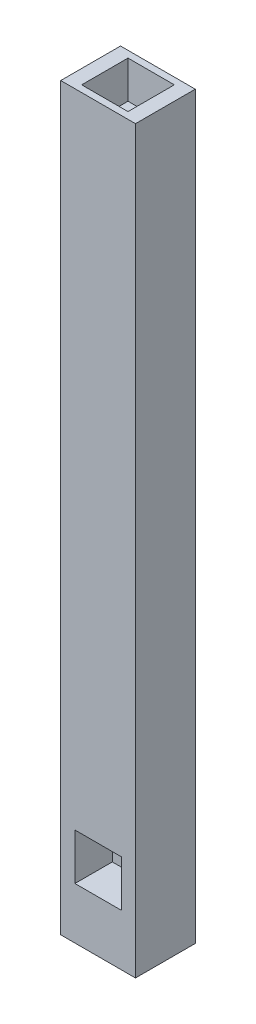
ISO-10303-21;
HEADER;
FILE_DESCRIPTION(('STEP AP214'),'2;1');
FILE_NAME('part.step','',(''),(''),'','','');
FILE_SCHEMA(('AUTOMOTIVE_DESIGN { 1 0 10303 214 1 1 1 1 }'));
ENDSEC;
DATA;
#1=APPLICATION_CONTEXT('core data for automotive mechanical design processes');
#2=APPLICATION_PROTOCOL_DEFINITION('international standard','automotive_design',2000,#1);
#3=PRODUCT_CONTEXT('',#1,'mechanical');
#4=PRODUCT('Part','Part','',(#3));
#5=PRODUCT_RELATED_PRODUCT_CATEGORY('part','',(#4));
#6=PRODUCT_DEFINITION_FORMATION('','',#4);
#7=PRODUCT_DEFINITION_CONTEXT('part definition',#1,'design');
#8=PRODUCT_DEFINITION('design','',#6,#7);
#9=PRODUCT_DEFINITION_SHAPE('','',#8);
#10=(LENGTH_UNIT() NAMED_UNIT(*) SI_UNIT(.MILLI.,.METRE.));
#11=(NAMED_UNIT(*) PLANE_ANGLE_UNIT() SI_UNIT($,.RADIAN.));
#12=(NAMED_UNIT(*) SI_UNIT($,.STERADIAN.) SOLID_ANGLE_UNIT());
#13=UNCERTAINTY_MEASURE_WITH_UNIT(LENGTH_MEASURE(1.E-05),#10,'distance_accuracy_value','');
#14=(GEOMETRIC_REPRESENTATION_CONTEXT(3) GLOBAL_UNCERTAINTY_ASSIGNED_CONTEXT((#13)) GLOBAL_UNIT_ASSIGNED_CONTEXT((#10,
#11,#12)) REPRESENTATION_CONTEXT('',''));
#15=CARTESIAN_POINT('',(0.,0.,0.));
#16=DIRECTION('',(0.,0.,1.));
#17=DIRECTION('',(1.,0.,0.));
#18=AXIS2_PLACEMENT_3D('',#15,#16,#17);
#19=CARTESIAN_POINT('',(-6.35,12.7,10.16));
#20=DIRECTION('',(0.,1.,0.));
#21=DIRECTION('',(0.,0.,1.));
#22=AXIS2_PLACEMENT_3D('',#19,#20,#21);
#23=PLANE('',#22);
#24=DIRECTION('',(-1.,0.,0.));
#25=VECTOR('',#24,1.);
#26=CARTESIAN_POINT('',(-3.937,12.7,9.017));
#27=LINE('',#26,#25);
#28=CARTESIAN_POINT('',(3.937,12.7,9.017));
#29=VERTEX_POINT('',#28);
#30=CARTESIAN_POINT('',(-3.937,12.7,9.017));
#31=VERTEX_POINT('',#30);
#32=EDGE_CURVE('E194',#29,#31,#27,.T.);
#33=ORIENTED_EDGE('',*,*,#32,.F.);
#34=DIRECTION('',(0.,0.,1.));
#35=VECTOR('',#34,1.);
#36=CARTESIAN_POINT('',(3.937,12.7,9.017));
#37=LINE('',#36,#35);
#38=CARTESIAN_POINT('',(3.937,12.7,1.143));
#39=VERTEX_POINT('',#38);
#40=EDGE_CURVE('E60',#39,#29,#37,.T.);
#41=ORIENTED_EDGE('',*,*,#40,.F.);
#42=DIRECTION('',(1.,0.,0.));
#43=VECTOR('',#42,1.);
#44=CARTESIAN_POINT('',(-3.937,12.7,1.143));
#45=LINE('',#44,#43);
#46=CARTESIAN_POINT('',(-3.937,12.7,1.143));
#47=VERTEX_POINT('',#46);
#48=EDGE_CURVE('E181',#47,#39,#45,.T.);
#49=ORIENTED_EDGE('',*,*,#48,.F.);
#50=DIRECTION('',(0.,0.,-1.));
#51=VECTOR('',#50,1.);
#52=CARTESIAN_POINT('',(-3.937,12.7,9.017));
#53=LINE('',#52,#51);
#54=EDGE_CURVE('E185',#31,#47,#53,.T.);
#55=ORIENTED_EDGE('',*,*,#54,.F.);
#56=EDGE_LOOP('',(#33,#41,#49,#55));
#57=FACE_BOUND('',#56,.T.);
#58=DIRECTION('',(1.,0.,0.));
#59=VECTOR('',#58,1.);
#60=CARTESIAN_POINT('',(-6.35,12.7,0.));
#61=LINE('',#60,#59);
#62=CARTESIAN_POINT('',(-6.35,12.7,0.));
#63=VERTEX_POINT('',#62);
#64=CARTESIAN_POINT('',(6.35,12.7,0.));
#65=VERTEX_POINT('',#64);
#66=EDGE_CURVE('E285',#63,#65,#61,.T.);
#67=ORIENTED_EDGE('',*,*,#66,.T.);
#68=DIRECTION('',(0.,0.,-1.));
#69=VECTOR('',#68,1.);
#70=CARTESIAN_POINT('',(6.35,12.7,10.16));
#71=LINE('',#70,#69);
#72=CARTESIAN_POINT('',(6.35,12.7,10.16));
#73=VERTEX_POINT('',#72);
#74=EDGE_CURVE('E11',#73,#65,#71,.T.);
#75=ORIENTED_EDGE('',*,*,#74,.F.);
#76=DIRECTION('',(1.,0.,0.));
#77=VECTOR('',#76,1.);
#78=CARTESIAN_POINT('',(-6.35,12.7,10.16));
#79=LINE('',#78,#77);
#80=CARTESIAN_POINT('',(-6.35,12.7,10.16));
#81=VERTEX_POINT('',#80);
#82=EDGE_CURVE('E295',#81,#73,#79,.T.);
#83=ORIENTED_EDGE('',*,*,#82,.F.);
#84=DIRECTION('',(0.,0.,-1.));
#85=VECTOR('',#84,1.);
#86=CARTESIAN_POINT('',(-6.35,12.7,10.16));
#87=LINE('',#86,#85);
#88=EDGE_CURVE('E311',#81,#63,#87,.T.);
#89=ORIENTED_EDGE('',*,*,#88,.T.);
#90=EDGE_LOOP('',(#67,#75,#83,#89));
#91=FACE_BOUND('',#90,.T.);
#92=ADVANCED_FACE('F45',(#57,#91),#23,.F.);
#93=CARTESIAN_POINT('',(6.35,12.7,10.16));
#94=DIRECTION('',(-1.,0.,0.));
#95=DIRECTION('',(0.,0.,1.));
#96=AXIS2_PLACEMENT_3D('',#93,#94,#95);
#97=PLANE('',#96);
#98=DIRECTION('',(0.,1.,0.));
#99=VECTOR('',#98,1.);
#100=CARTESIAN_POINT('',(6.35,12.7,0.));
#101=LINE('',#100,#99);
#102=CARTESIAN_POINT('',(6.35,138.43,0.));
#103=VERTEX_POINT('',#102);
#104=EDGE_CURVE('E315',#65,#103,#101,.T.);
#105=ORIENTED_EDGE('',*,*,#104,.T.);
#106=DIRECTION('',(0.,0.,-1.));
#107=VECTOR('',#106,1.);
#108=CARTESIAN_POINT('',(6.35,138.43,10.16));
#109=LINE('',#108,#107);
#110=CARTESIAN_POINT('',(6.35,138.43,10.16));
#111=VERTEX_POINT('',#110);
#112=EDGE_CURVE('E53',#111,#103,#109,.T.);
#113=ORIENTED_EDGE('',*,*,#112,.F.);
#114=DIRECTION('',(0.,1.,0.));
#115=VECTOR('',#114,1.);
#116=CARTESIAN_POINT('',(6.35,12.7,10.16));
#117=LINE('',#116,#115);
#118=EDGE_CURVE('E299',#73,#111,#117,.T.);
#119=ORIENTED_EDGE('',*,*,#118,.F.);
#120=ORIENTED_EDGE('',*,*,#74,.T.);
#121=EDGE_LOOP('',(#105,#113,#119,#120));
#122=FACE_BOUND('',#121,.T.);
#123=ADVANCED_FACE('F337',(#122),#97,.F.);
#124=CARTESIAN_POINT('',(-6.35,138.43,10.16));
#125=DIRECTION('',(0.,1.,0.));
#126=DIRECTION('',(0.,0.,1.));
#127=AXIS2_PLACEMENT_3D('',#124,#125,#126);
#128=PLANE('',#127);
#129=DIRECTION('',(0.,0.,1.));
#130=VECTOR('',#129,1.);
#131=CARTESIAN_POINT('',(-3.937,138.43,9.017));
#132=LINE('',#131,#130);
#133=CARTESIAN_POINT('',(-3.937,138.43,1.143));
#134=VERTEX_POINT('',#133);
#135=CARTESIAN_POINT('',(-3.937,138.43,9.017));
#136=VERTEX_POINT('',#135);
#137=EDGE_CURVE('E242',#134,#136,#132,.T.);
#138=ORIENTED_EDGE('',*,*,#137,.F.);
#139=DIRECTION('',(-1.,0.,0.));
#140=VECTOR('',#139,1.);
#141=CARTESIAN_POINT('',(3.937,138.43,1.143));
#142=LINE('',#141,#140);
#143=CARTESIAN_POINT('',(3.937,138.43,1.143));
#144=VERTEX_POINT('',#143);
#145=EDGE_CURVE('E256',#144,#134,#142,.T.);
#146=ORIENTED_EDGE('',*,*,#145,.F.);
#147=DIRECTION('',(0.,0.,-1.));
#148=VECTOR('',#147,1.);
#149=CARTESIAN_POINT('',(3.937,138.43,9.017));
#150=LINE('',#149,#148);
#151=CARTESIAN_POINT('',(3.937,138.43,9.017));
#152=VERTEX_POINT('',#151);
#153=EDGE_CURVE('E275',#152,#144,#150,.T.);
#154=ORIENTED_EDGE('',*,*,#153,.F.);
#155=DIRECTION('',(1.,0.,0.));
#156=VECTOR('',#155,1.);
#157=CARTESIAN_POINT('',(3.937,138.43,9.017));
#158=LINE('',#157,#156);
#159=EDGE_CURVE('E271',#136,#152,#158,.T.);
#160=ORIENTED_EDGE('',*,*,#159,.F.);
#161=EDGE_LOOP('',(#138,#146,#154,#160));
#162=FACE_BOUND('',#161,.T.);
#163=DIRECTION('',(1.,0.,0.));
#164=VECTOR('',#163,1.);
#165=CARTESIAN_POINT('',(-6.35,138.43,0.));
#166=LINE('',#165,#164);
#167=CARTESIAN_POINT('',(-6.35,138.43,0.));
#168=VERTEX_POINT('',#167);
#169=EDGE_CURVE('E319',#168,#103,#166,.T.);
#170=ORIENTED_EDGE('',*,*,#169,.F.);
#171=DIRECTION('',(0.,0.,-1.));
#172=VECTOR('',#171,1.);
#173=CARTESIAN_POINT('',(-6.35,138.43,10.16));
#174=LINE('',#173,#172);
#175=CARTESIAN_POINT('',(-6.35,138.43,10.16));
#176=VERTEX_POINT('',#175);
#177=EDGE_CURVE('E328',#176,#168,#174,.T.);
#178=ORIENTED_EDGE('',*,*,#177,.F.);
#179=DIRECTION('',(1.,0.,0.));
#180=VECTOR('',#179,1.);
#181=CARTESIAN_POINT('',(-6.35,138.43,10.16));
#182=LINE('',#181,#180);
#183=EDGE_CURVE('E303',#176,#111,#182,.T.);
#184=ORIENTED_EDGE('',*,*,#183,.T.);
#185=ORIENTED_EDGE('',*,*,#112,.T.);
#186=EDGE_LOOP('',(#170,#178,#184,#185));
#187=FACE_BOUND('',#186,.T.);
#188=ADVANCED_FACE('F334',(#162,#187),#128,.T.);
#189=CARTESIAN_POINT('',(-6.35,12.7,10.16));
#190=DIRECTION('',(-1.,0.,0.));
#191=DIRECTION('',(0.,0.,1.));
#192=AXIS2_PLACEMENT_3D('',#189,#190,#191);
#193=PLANE('',#192);
#194=DIRECTION('',(0.,1.,0.));
#195=VECTOR('',#194,1.);
#196=CARTESIAN_POINT('',(-6.35,12.7,0.));
#197=LINE('',#196,#195);
#198=EDGE_CURVE('E300',#63,#168,#197,.T.);
#199=ORIENTED_EDGE('',*,*,#198,.F.);
#200=ORIENTED_EDGE('',*,*,#88,.F.);
#201=DIRECTION('',(0.,1.,0.));
#202=VECTOR('',#201,1.);
#203=CARTESIAN_POINT('',(-6.35,12.7,10.16));
#204=LINE('',#203,#202);
#205=EDGE_CURVE('E307',#81,#176,#204,.T.);
#206=ORIENTED_EDGE('',*,*,#205,.T.);
#207=ORIENTED_EDGE('',*,*,#177,.T.);
#208=EDGE_LOOP('',(#199,#200,#206,#207));
#209=FACE_BOUND('',#208,.T.);
#210=ADVANCED_FACE('F344',(#209),#193,.T.);
#211=CARTESIAN_POINT('',(0.,0.,10.16));
#212=DIRECTION('',(0.,0.,1.));
#213=DIRECTION('',(1.,0.,0.));
#214=AXIS2_PLACEMENT_3D('',#211,#212,#213);
#215=PLANE('',#214);
#216=DIRECTION('',(0.,1.,0.));
#217=VECTOR('',#216,1.);
#218=CARTESIAN_POINT('',(3.937,21.463,10.16));
#219=LINE('',#218,#217);
#220=CARTESIAN_POINT('',(3.937,21.463,10.16));
#221=VERTEX_POINT('',#220);
#222=CARTESIAN_POINT('',(3.937,29.337,10.16));
#223=VERTEX_POINT('',#222);
#224=EDGE_CURVE('E68',#221,#223,#219,.T.);
#225=ORIENTED_EDGE('',*,*,#224,.F.);
#226=DIRECTION('',(1.,0.,0.));
#227=VECTOR('',#226,1.);
#228=CARTESIAN_POINT('',(-3.937,21.463,10.16));
#229=LINE('',#228,#227);
#230=CARTESIAN_POINT('',(-3.937,21.463,10.16));
#231=VERTEX_POINT('',#230);
#232=EDGE_CURVE('E213',#231,#221,#229,.T.);
#233=ORIENTED_EDGE('',*,*,#232,.F.);
#234=DIRECTION('',(0.,-1.,0.));
#235=VECTOR('',#234,1.);
#236=CARTESIAN_POINT('',(-3.937,21.463,10.16));
#237=LINE('',#236,#235);
#238=CARTESIAN_POINT('',(-3.937,29.337,10.16));
#239=VERTEX_POINT('',#238);
#240=EDGE_CURVE('E232',#239,#231,#237,.T.);
#241=ORIENTED_EDGE('',*,*,#240,.F.);
#242=DIRECTION('',(-1.,0.,0.));
#243=VECTOR('',#242,1.);
#244=CARTESIAN_POINT('',(-3.937,29.337,10.16));
#245=LINE('',#244,#243);
#246=EDGE_CURVE('E228',#223,#239,#245,.T.);
#247=ORIENTED_EDGE('',*,*,#246,.F.);
#248=EDGE_LOOP('',(#225,#233,#241,#247));
#249=FACE_BOUND('',#248,.T.);
#250=ORIENTED_EDGE('',*,*,#82,.T.);
#251=ORIENTED_EDGE('',*,*,#118,.T.);
#252=ORIENTED_EDGE('',*,*,#183,.F.);
#253=ORIENTED_EDGE('',*,*,#205,.F.);
#254=EDGE_LOOP('',(#250,#251,#252,#253));
#255=FACE_BOUND('',#254,.T.);
#256=ADVANCED_FACE('F348',(#249,#255),#215,.T.);
#257=CARTESIAN_POINT('',(0.,0.,0.));
#258=DIRECTION('',(0.,0.,1.));
#259=DIRECTION('',(1.,0.,0.));
#260=AXIS2_PLACEMENT_3D('',#257,#258,#259);
#261=PLANE('',#260);
#262=ORIENTED_EDGE('',*,*,#66,.F.);
#263=ORIENTED_EDGE('',*,*,#198,.T.);
#264=ORIENTED_EDGE('',*,*,#169,.T.);
#265=ORIENTED_EDGE('',*,*,#104,.F.);
#266=EDGE_LOOP('',(#262,#263,#264,#265));
#267=FACE_BOUND('',#266,.T.);
#268=ADVANCED_FACE('F341',(#267),#261,.F.);
#269=CARTESIAN_POINT('',(-3.937,132.08,9.017));
#270=DIRECTION('',(-1.,0.,0.));
#271=DIRECTION('',(0.,0.,1.));
#272=AXIS2_PLACEMENT_3D('',#269,#270,#271);
#273=PLANE('',#272);
#274=ORIENTED_EDGE('',*,*,#137,.T.);
#275=DIRECTION('',(0.,1.,0.));
#276=VECTOR('',#275,1.);
#277=CARTESIAN_POINT('',(-3.937,132.08,9.017));
#278=LINE('',#277,#276);
#279=CARTESIAN_POINT('',(-3.937,132.08,9.017));
#280=VERTEX_POINT('',#279);
#281=EDGE_CURVE('E268',#280,#136,#278,.T.);
#282=ORIENTED_EDGE('',*,*,#281,.F.);
#283=DIRECTION('',(0.,0.,1.));
#284=VECTOR('',#283,1.);
#285=CARTESIAN_POINT('',(-3.937,132.08,9.017));
#286=LINE('',#285,#284);
#287=CARTESIAN_POINT('',(-3.937,132.08,1.143));
#288=VERTEX_POINT('',#287);
#289=EDGE_CURVE('E251',#288,#280,#286,.T.);
#290=ORIENTED_EDGE('',*,*,#289,.F.);
#291=DIRECTION('',(0.,1.,0.));
#292=VECTOR('',#291,1.);
#293=CARTESIAN_POINT('',(-3.937,132.08,1.143));
#294=LINE('',#293,#292);
#295=EDGE_CURVE('E282',#288,#134,#294,.T.);
#296=ORIENTED_EDGE('',*,*,#295,.T.);
#297=EDGE_LOOP('',(#274,#282,#290,#296));
#298=FACE_BOUND('',#297,.T.);
#299=ADVANCED_FACE('F401',(#298),#273,.F.);
#300=CARTESIAN_POINT('',(3.937,132.08,1.143));
#301=DIRECTION('',(0.,0.,-1.));
#302=DIRECTION('',(-1.,0.,0.));
#303=AXIS2_PLACEMENT_3D('',#300,#301,#302);
#304=PLANE('',#303);
#305=ORIENTED_EDGE('',*,*,#145,.T.);
#306=ORIENTED_EDGE('',*,*,#295,.F.);
#307=DIRECTION('',(-1.,0.,0.));
#308=VECTOR('',#307,1.);
#309=CARTESIAN_POINT('',(3.937,132.08,1.143));
#310=LINE('',#309,#308);
#311=CARTESIAN_POINT('',(3.937,132.08,1.143));
#312=VERTEX_POINT('',#311);
#313=EDGE_CURVE('E264',#312,#288,#310,.T.);
#314=ORIENTED_EDGE('',*,*,#313,.F.);
#315=DIRECTION('',(0.,1.,0.));
#316=VECTOR('',#315,1.);
#317=CARTESIAN_POINT('',(3.937,132.08,1.143));
#318=LINE('',#317,#316);
#319=EDGE_CURVE('E286',#312,#144,#318,.T.);
#320=ORIENTED_EDGE('',*,*,#319,.T.);
#321=EDGE_LOOP('',(#305,#306,#314,#320));
#322=FACE_BOUND('',#321,.T.);
#323=ADVANCED_FACE('F397',(#322),#304,.F.);
#324=CARTESIAN_POINT('',(3.937,132.08,9.017));
#325=DIRECTION('',(1.,0.,0.));
#326=DIRECTION('',(0.,0.,-1.));
#327=AXIS2_PLACEMENT_3D('',#324,#325,#326);
#328=PLANE('',#327);
#329=ORIENTED_EDGE('',*,*,#153,.T.);
#330=ORIENTED_EDGE('',*,*,#319,.F.);
#331=DIRECTION('',(0.,0.,-1.));
#332=VECTOR('',#331,1.);
#333=CARTESIAN_POINT('',(3.937,132.08,9.017));
#334=LINE('',#333,#332);
#335=CARTESIAN_POINT('',(3.937,132.08,9.017));
#336=VERTEX_POINT('',#335);
#337=EDGE_CURVE('E260',#336,#312,#334,.T.);
#338=ORIENTED_EDGE('',*,*,#337,.F.);
#339=DIRECTION('',(0.,1.,0.));
#340=VECTOR('',#339,1.);
#341=CARTESIAN_POINT('',(3.937,132.08,9.017));
#342=LINE('',#341,#340);
#343=EDGE_CURVE('E289',#336,#152,#342,.T.);
#344=ORIENTED_EDGE('',*,*,#343,.T.);
#345=EDGE_LOOP('',(#329,#330,#338,#344));
#346=FACE_BOUND('',#345,.T.);
#347=ADVANCED_FACE('F400',(#346),#328,.F.);
#348=CARTESIAN_POINT('',(3.937,132.08,9.017));
#349=DIRECTION('',(0.,0.,1.));
#350=DIRECTION('',(1.,0.,0.));
#351=AXIS2_PLACEMENT_3D('',#348,#349,#350);
#352=PLANE('',#351);
#353=ORIENTED_EDGE('',*,*,#159,.T.);
#354=ORIENTED_EDGE('',*,*,#343,.F.);
#355=DIRECTION('',(1.,0.,0.));
#356=VECTOR('',#355,1.);
#357=CARTESIAN_POINT('',(3.937,132.08,9.017));
#358=LINE('',#357,#356);
#359=EDGE_CURVE('E255',#280,#336,#358,.T.);
#360=ORIENTED_EDGE('',*,*,#359,.F.);
#361=ORIENTED_EDGE('',*,*,#281,.T.);
#362=EDGE_LOOP('',(#353,#354,#360,#361));
#363=FACE_BOUND('',#362,.T.);
#364=ADVANCED_FACE('F395',(#363),#352,.F.);
#365=CARTESIAN_POINT('',(0.,132.08,0.));
#366=DIRECTION('',(0.,1.,0.));
#367=DIRECTION('',(0.,0.,1.));
#368=AXIS2_PLACEMENT_3D('',#365,#366,#367);
#369=PLANE('',#368);
#370=ORIENTED_EDGE('',*,*,#289,.T.);
#371=ORIENTED_EDGE('',*,*,#359,.T.);
#372=ORIENTED_EDGE('',*,*,#337,.T.);
#373=ORIENTED_EDGE('',*,*,#313,.T.);
#374=EDGE_LOOP('',(#370,#371,#372,#373));
#375=FACE_BOUND('',#374,.T.);
#376=ADVANCED_FACE('F392',(#375),#369,.T.);
#377=CARTESIAN_POINT('',(3.937,21.463,3.81));
#378=DIRECTION('',(1.,0.,0.));
#379=DIRECTION('',(0.,0.,-1.));
#380=AXIS2_PLACEMENT_3D('',#377,#378,#379);
#381=PLANE('',#380);
#382=ORIENTED_EDGE('',*,*,#224,.T.);
#383=DIRECTION('',(0.,0.,1.));
#384=VECTOR('',#383,1.);
#385=CARTESIAN_POINT('',(3.937,29.337,3.81));
#386=LINE('',#385,#384);
#387=CARTESIAN_POINT('',(3.937,29.337,3.81));
#388=VERTEX_POINT('',#387);
#389=EDGE_CURVE('E225',#388,#223,#386,.T.);
#390=ORIENTED_EDGE('',*,*,#389,.F.);
#391=DIRECTION('',(0.,1.,0.));
#392=VECTOR('',#391,1.);
#393=CARTESIAN_POINT('',(3.937,21.463,3.81));
#394=LINE('',#393,#392);
#395=CARTESIAN_POINT('',(3.937,21.463,3.81));
#396=VERTEX_POINT('',#395);
#397=EDGE_CURVE('E208',#396,#388,#394,.T.);
#398=ORIENTED_EDGE('',*,*,#397,.F.);
#399=DIRECTION('',(0.,0.,1.));
#400=VECTOR('',#399,1.);
#401=CARTESIAN_POINT('',(3.937,21.463,3.81));
#402=LINE('',#401,#400);
#403=EDGE_CURVE('E239',#396,#221,#402,.T.);
#404=ORIENTED_EDGE('',*,*,#403,.T.);
#405=EDGE_LOOP('',(#382,#390,#398,#404));
#406=FACE_BOUND('',#405,.T.);
#407=ADVANCED_FACE('F382',(#406),#381,.F.);
#408=CARTESIAN_POINT('',(-3.937,21.463,3.81));
#409=DIRECTION('',(0.,-1.,0.));
#410=DIRECTION('',(0.,0.,-1.));
#411=AXIS2_PLACEMENT_3D('',#408,#409,#410);
#412=PLANE('',#411);
#413=ORIENTED_EDGE('',*,*,#232,.T.);
#414=ORIENTED_EDGE('',*,*,#403,.F.);
#415=DIRECTION('',(1.,0.,0.));
#416=VECTOR('',#415,1.);
#417=CARTESIAN_POINT('',(-3.937,21.463,3.81));
#418=LINE('',#417,#416);
#419=CARTESIAN_POINT('',(-3.937,21.463,3.81));
#420=VERTEX_POINT('',#419);
#421=EDGE_CURVE('E221',#420,#396,#418,.T.);
#422=ORIENTED_EDGE('',*,*,#421,.F.);
#423=DIRECTION('',(0.,0.,1.));
#424=VECTOR('',#423,1.);
#425=CARTESIAN_POINT('',(-3.937,21.463,3.81));
#426=LINE('',#425,#424);
#427=EDGE_CURVE('E243',#420,#231,#426,.T.);
#428=ORIENTED_EDGE('',*,*,#427,.T.);
#429=EDGE_LOOP('',(#413,#414,#422,#428));
#430=FACE_BOUND('',#429,.T.);
#431=ADVANCED_FACE('F378',(#430),#412,.F.);
#432=CARTESIAN_POINT('',(-3.937,21.463,3.81));
#433=DIRECTION('',(-1.,0.,0.));
#434=DIRECTION('',(0.,0.,1.));
#435=AXIS2_PLACEMENT_3D('',#432,#433,#434);
#436=PLANE('',#435);
#437=ORIENTED_EDGE('',*,*,#240,.T.);
#438=ORIENTED_EDGE('',*,*,#427,.F.);
#439=DIRECTION('',(0.,-1.,0.));
#440=VECTOR('',#439,1.);
#441=CARTESIAN_POINT('',(-3.937,21.463,3.81));
#442=LINE('',#441,#440);
#443=CARTESIAN_POINT('',(-3.937,29.337,3.81));
#444=VERTEX_POINT('',#443);
#445=EDGE_CURVE('E217',#444,#420,#442,.T.);
#446=ORIENTED_EDGE('',*,*,#445,.F.);
#447=DIRECTION('',(0.,0.,1.));
#448=VECTOR('',#447,1.);
#449=CARTESIAN_POINT('',(-3.937,29.337,3.81));
#450=LINE('',#449,#448);
#451=EDGE_CURVE('E246',#444,#239,#450,.T.);
#452=ORIENTED_EDGE('',*,*,#451,.T.);
#453=EDGE_LOOP('',(#437,#438,#446,#452));
#454=FACE_BOUND('',#453,.T.);
#455=ADVANCED_FACE('F381',(#454),#436,.F.);
#456=CARTESIAN_POINT('',(-3.937,29.337,3.81));
#457=DIRECTION('',(0.,1.,0.));
#458=DIRECTION('',(0.,0.,1.));
#459=AXIS2_PLACEMENT_3D('',#456,#457,#458);
#460=PLANE('',#459);
#461=ORIENTED_EDGE('',*,*,#246,.T.);
#462=ORIENTED_EDGE('',*,*,#451,.F.);
#463=DIRECTION('',(-1.,0.,0.));
#464=VECTOR('',#463,1.);
#465=CARTESIAN_POINT('',(-3.937,29.337,3.81));
#466=LINE('',#465,#464);
#467=EDGE_CURVE('E212',#388,#444,#466,.T.);
#468=ORIENTED_EDGE('',*,*,#467,.F.);
#469=ORIENTED_EDGE('',*,*,#389,.T.);
#470=EDGE_LOOP('',(#461,#462,#468,#469));
#471=FACE_BOUND('',#470,.T.);
#472=ADVANCED_FACE('F376',(#471),#460,.F.);
#473=CARTESIAN_POINT('',(0.,0.,3.81));
#474=DIRECTION('',(0.,0.,-1.));
#475=DIRECTION('',(-1.,0.,0.));
#476=AXIS2_PLACEMENT_3D('',#473,#474,#475);
#477=PLANE('',#476);
#478=ORIENTED_EDGE('',*,*,#397,.T.);
#479=ORIENTED_EDGE('',*,*,#467,.T.);
#480=ORIENTED_EDGE('',*,*,#445,.T.);
#481=ORIENTED_EDGE('',*,*,#421,.T.);
#482=EDGE_LOOP('',(#478,#479,#480,#481));
#483=FACE_BOUND('',#482,.T.);
#484=ADVANCED_FACE('F368',(#483),#477,.F.);
#485=CARTESIAN_POINT('',(3.937,19.05,9.017));
#486=DIRECTION('',(1.,0.,0.));
#487=DIRECTION('',(0.,0.,-1.));
#488=AXIS2_PLACEMENT_3D('',#485,#486,#487);
#489=PLANE('',#488);
#490=ORIENTED_EDGE('',*,*,#40,.T.);
#491=DIRECTION('',(0.,-1.,0.));
#492=VECTOR('',#491,1.);
#493=CARTESIAN_POINT('',(3.937,19.05,9.017));
#494=LINE('',#493,#492);
#495=CARTESIAN_POINT('',(3.937,19.05,9.017));
#496=VERTEX_POINT('',#495);
#497=EDGE_CURVE('E156',#496,#29,#494,.T.);
#498=ORIENTED_EDGE('',*,*,#497,.F.);
#499=DIRECTION('',(0.,0.,1.));
#500=VECTOR('',#499,1.);
#501=CARTESIAN_POINT('',(3.937,19.05,9.017));
#502=LINE('',#501,#500);
#503=CARTESIAN_POINT('',(3.937,19.05,1.143));
#504=VERTEX_POINT('',#503);
#505=EDGE_CURVE('E160',#504,#496,#502,.T.);
#506=ORIENTED_EDGE('',*,*,#505,.F.);
#507=DIRECTION('',(0.,-1.,0.));
#508=VECTOR('',#507,1.);
#509=CARTESIAN_POINT('',(3.937,19.05,1.143));
#510=LINE('',#509,#508);
#511=EDGE_CURVE('E200',#504,#39,#510,.T.);
#512=ORIENTED_EDGE('',*,*,#511,.T.);
#513=EDGE_LOOP('',(#490,#498,#506,#512));
#514=FACE_BOUND('',#513,.T.);
#515=ADVANCED_FACE('F158',(#514),#489,.F.);
#516=CARTESIAN_POINT('',(-3.937,19.05,1.143));
#517=DIRECTION('',(0.,0.,-1.));
#518=DIRECTION('',(-1.,0.,0.));
#519=AXIS2_PLACEMENT_3D('',#516,#517,#518);
#520=PLANE('',#519);
#521=ORIENTED_EDGE('',*,*,#48,.T.);
#522=ORIENTED_EDGE('',*,*,#511,.F.);
#523=DIRECTION('',(1.,0.,0.));
#524=VECTOR('',#523,1.);
#525=CARTESIAN_POINT('',(-3.937,19.05,1.143));
#526=LINE('',#525,#524);
#527=CARTESIAN_POINT('',(-3.937,19.05,1.143));
#528=VERTEX_POINT('',#527);
#529=EDGE_CURVE('E167',#528,#504,#526,.T.);
#530=ORIENTED_EDGE('',*,*,#529,.F.);
#531=DIRECTION('',(0.,-1.,0.));
#532=VECTOR('',#531,1.);
#533=CARTESIAN_POINT('',(-3.937,19.05,1.143));
#534=LINE('',#533,#532);
#535=EDGE_CURVE('E203',#528,#47,#534,.T.);
#536=ORIENTED_EDGE('',*,*,#535,.T.);
#537=EDGE_LOOP('',(#521,#522,#530,#536));
#538=FACE_BOUND('',#537,.T.);
#539=ADVANCED_FACE('F360',(#538),#520,.F.);
#540=CARTESIAN_POINT('',(-3.937,19.05,9.017));
#541=DIRECTION('',(-1.,0.,0.));
#542=DIRECTION('',(0.,0.,1.));
#543=AXIS2_PLACEMENT_3D('',#540,#541,#542);
#544=PLANE('',#543);
#545=ORIENTED_EDGE('',*,*,#54,.T.);
#546=ORIENTED_EDGE('',*,*,#535,.F.);
#547=DIRECTION('',(0.,0.,-1.));
#548=VECTOR('',#547,1.);
#549=CARTESIAN_POINT('',(-3.937,19.05,9.017));
#550=LINE('',#549,#548);
#551=CARTESIAN_POINT('',(-3.937,19.05,9.017));
#552=VERTEX_POINT('',#551);
#553=EDGE_CURVE('E176',#552,#528,#550,.T.);
#554=ORIENTED_EDGE('',*,*,#553,.F.);
#555=DIRECTION('',(0.,-1.,0.));
#556=VECTOR('',#555,1.);
#557=CARTESIAN_POINT('',(-3.937,19.05,9.017));
#558=LINE('',#557,#556);
#559=EDGE_CURVE('E166',#552,#31,#558,.T.);
#560=ORIENTED_EDGE('',*,*,#559,.T.);
#561=EDGE_LOOP('',(#545,#546,#554,#560));
#562=FACE_BOUND('',#561,.T.);
#563=ADVANCED_FACE('F358',(#562),#544,.F.);
#564=CARTESIAN_POINT('',(-3.937,19.05,9.017));
#565=DIRECTION('',(0.,0.,1.));
#566=DIRECTION('',(1.,0.,0.));
#567=AXIS2_PLACEMENT_3D('',#564,#565,#566);
#568=PLANE('',#567);
#569=ORIENTED_EDGE('',*,*,#32,.T.);
#570=ORIENTED_EDGE('',*,*,#559,.F.);
#571=DIRECTION('',(-1.,0.,0.));
#572=VECTOR('',#571,1.);
#573=CARTESIAN_POINT('',(-3.937,19.05,9.017));
#574=LINE('',#573,#572);
#575=EDGE_CURVE('E170',#496,#552,#574,.T.);
#576=ORIENTED_EDGE('',*,*,#575,.F.);
#577=ORIENTED_EDGE('',*,*,#497,.T.);
#578=EDGE_LOOP('',(#569,#570,#576,#577));
#579=FACE_BOUND('',#578,.T.);
#580=ADVANCED_FACE('F171',(#579),#568,.F.);
#581=CARTESIAN_POINT('',(0.,19.05,0.));
#582=DIRECTION('',(0.,-1.,0.));
#583=DIRECTION('',(0.,0.,-1.));
#584=AXIS2_PLACEMENT_3D('',#581,#582,#583);
#585=PLANE('',#584);
#586=ORIENTED_EDGE('',*,*,#505,.T.);
#587=ORIENTED_EDGE('',*,*,#575,.T.);
#588=ORIENTED_EDGE('',*,*,#553,.T.);
#589=ORIENTED_EDGE('',*,*,#529,.T.);
#590=EDGE_LOOP('',(#586,#587,#588,#589));
#591=FACE_BOUND('',#590,.T.);
#592=ADVANCED_FACE('F178',(#591),#585,.T.);
#593=CLOSED_SHELL('',(#92,#123,#188,#210,#256,#268,#299,#323,#347,#364,#376,#407,#431,#455,#472,
#484,#515,#539,#563,#580,#592));
#594=MANIFOLD_SOLID_BREP('B2',#593);
#595=ADVANCED_BREP_SHAPE_REPRESENTATION('',(#18,#594),#14);
#596=SHAPE_DEFINITION_REPRESENTATION(#9,#595);
ENDSEC;
END-ISO-10303-21;
